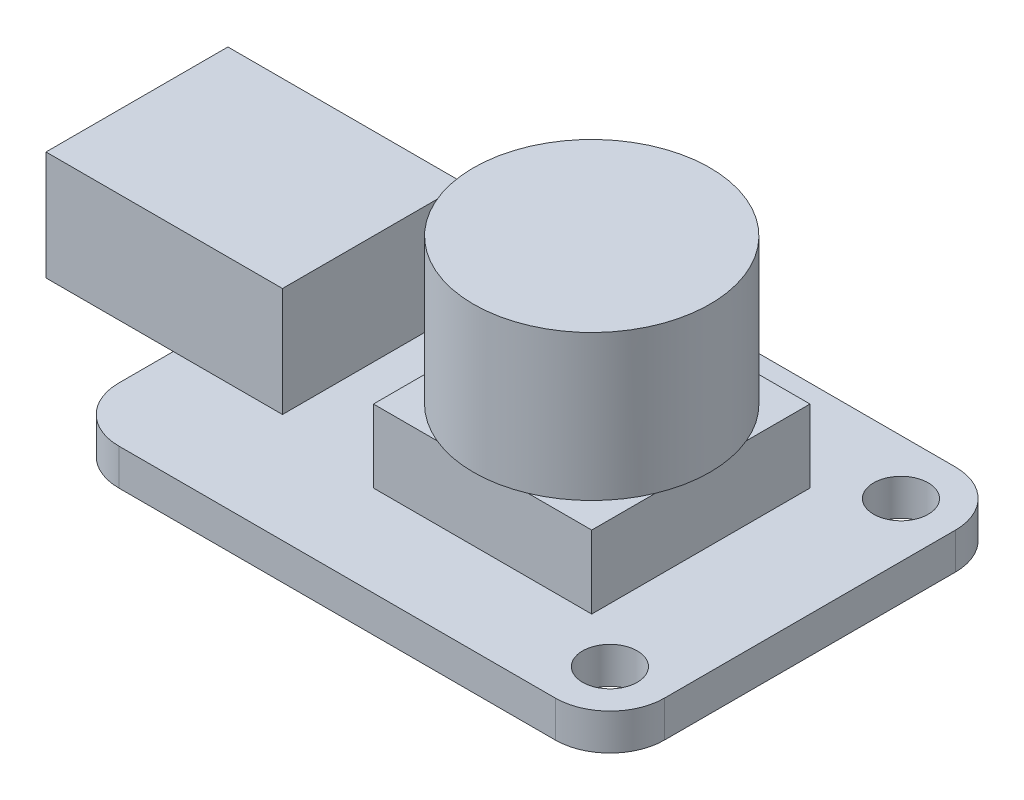
ISO-10303-21;
HEADER;
FILE_DESCRIPTION(('STEP AP214'),'2;1');
FILE_NAME('part.step','',(''),(''),'','','');
FILE_SCHEMA(('AUTOMOTIVE_DESIGN { 1 0 10303 214 1 1 1 1 }'));
ENDSEC;
DATA;
#1=APPLICATION_CONTEXT('core data for automotive mechanical design processes');
#2=APPLICATION_PROTOCOL_DEFINITION('international standard','automotive_design',2000,#1);
#3=PRODUCT_CONTEXT('',#1,'mechanical');
#4=PRODUCT('Part','Part','',(#3));
#5=PRODUCT_RELATED_PRODUCT_CATEGORY('part','',(#4));
#6=PRODUCT_DEFINITION_FORMATION('','',#4);
#7=PRODUCT_DEFINITION_CONTEXT('part definition',#1,'design');
#8=PRODUCT_DEFINITION('design','',#6,#7);
#9=PRODUCT_DEFINITION_SHAPE('','',#8);
#10=(LENGTH_UNIT() NAMED_UNIT(*) SI_UNIT(.MILLI.,.METRE.));
#11=(NAMED_UNIT(*) PLANE_ANGLE_UNIT() SI_UNIT($,.RADIAN.));
#12=(NAMED_UNIT(*) SI_UNIT($,.STERADIAN.) SOLID_ANGLE_UNIT());
#13=UNCERTAINTY_MEASURE_WITH_UNIT(LENGTH_MEASURE(1.E-05),#10,'distance_accuracy_value','');
#14=(GEOMETRIC_REPRESENTATION_CONTEXT(3) GLOBAL_UNCERTAINTY_ASSIGNED_CONTEXT((#13)) GLOBAL_UNIT_ASSIGNED_CONTEXT((#10,
#11,#12)) REPRESENTATION_CONTEXT('',''));
#15=CARTESIAN_POINT('',(0.,0.,0.));
#16=DIRECTION('',(0.,0.,1.));
#17=DIRECTION('',(1.,0.,0.));
#18=AXIS2_PLACEMENT_3D('',#15,#16,#17);
#19=CARTESIAN_POINT('',(0.,6.,0.));
#20=DIRECTION('',(0.,1.,0.));
#21=DIRECTION('',(0.,0.,1.));
#22=AXIS2_PLACEMENT_3D('',#19,#20,#21);
#23=PLANE('',#22);
#24=CARTESIAN_POINT('',(3.,6.,0.));
#25=DIRECTION('',(0.,1.,0.));
#26=DIRECTION('',(0.,0.,1.));
#27=AXIS2_PLACEMENT_3D('',#24,#25,#26);
#28=CIRCLE('',#27,6.5);
#29=CARTESIAN_POINT('',(5.5,6.,6.));
#30=VERTEX_POINT('',#29);
#31=CARTESIAN_POINT('',(9.,6.,2.5));
#32=VERTEX_POINT('',#31);
#33=EDGE_CURVE('E53',#30,#32,#28,.T.);
#34=ORIENTED_EDGE('',*,*,#33,.F.);
#35=DIRECTION('',(1.,0.,0.));
#36=VECTOR('',#35,1.);
#37=CARTESIAN_POINT('',(-3.,6.,6.));
#38=LINE('',#37,#36);
#39=CARTESIAN_POINT('',(9.,6.,6.));
#40=VERTEX_POINT('',#39);
#41=EDGE_CURVE('E189',#30,#40,#38,.T.);
#42=ORIENTED_EDGE('',*,*,#41,.T.);
#43=DIRECTION('',(0.,0.,-1.));
#44=VECTOR('',#43,1.);
#45=CARTESIAN_POINT('',(9.,6.,-6.));
#46=LINE('',#45,#44);
#47=EDGE_CURVE('E229',#40,#32,#46,.T.);
#48=ORIENTED_EDGE('',*,*,#47,.T.);
#49=EDGE_LOOP('',(#34,#42,#48));
#50=FACE_BOUND('',#49,.T.);
#51=ADVANCED_FACE('F35',(#50),#23,.T.);
#52=CARTESIAN_POINT('',(9.,6.,-2.5));
#53=VERTEX_POINT('',#52);
#54=CARTESIAN_POINT('',(5.5,6.,-6.));
#55=VERTEX_POINT('',#54);
#56=EDGE_CURVE('E11',#53,#55,#28,.T.);
#57=ORIENTED_EDGE('',*,*,#56,.F.);
#58=CARTESIAN_POINT('',(9.,6.,-6.));
#59=VERTEX_POINT('',#58);
#60=EDGE_CURVE('E244',#53,#59,#46,.T.);
#61=ORIENTED_EDGE('',*,*,#60,.T.);
#62=DIRECTION('',(-1.,0.,0.));
#63=VECTOR('',#62,1.);
#64=CARTESIAN_POINT('',(-3.,6.,-6.));
#65=LINE('',#64,#63);
#66=EDGE_CURVE('E226',#59,#55,#65,.T.);
#67=ORIENTED_EDGE('',*,*,#66,.T.);
#68=EDGE_LOOP('',(#57,#61,#67));
#69=FACE_BOUND('',#68,.T.);
#70=ADVANCED_FACE('F434',(#69),#23,.T.);
#71=CARTESIAN_POINT('',(0.499999999999997,6.,-6.));
#72=VERTEX_POINT('',#71);
#73=CARTESIAN_POINT('',(-3.,6.,-2.5));
#74=VERTEX_POINT('',#73);
#75=EDGE_CURVE('E44',#72,#74,#28,.T.);
#76=ORIENTED_EDGE('',*,*,#75,.F.);
#77=CARTESIAN_POINT('',(-3.,6.,-6.));
#78=VERTEX_POINT('',#77);
#79=EDGE_CURVE('E227',#72,#78,#65,.T.);
#80=ORIENTED_EDGE('',*,*,#79,.T.);
#81=DIRECTION('',(0.,0.,1.));
#82=VECTOR('',#81,1.);
#83=CARTESIAN_POINT('',(-3.,6.,-6.));
#84=LINE('',#83,#82);
#85=EDGE_CURVE('E231',#78,#74,#84,.T.);
#86=ORIENTED_EDGE('',*,*,#85,.T.);
#87=EDGE_LOOP('',(#76,#80,#86));
#88=FACE_BOUND('',#87,.T.);
#89=ADVANCED_FACE('F439',(#88),#23,.T.);
#90=CARTESIAN_POINT('',(12.,2.,-8.));
#91=DIRECTION('',(0.,1.,0.));
#92=DIRECTION('',(0.,0.,1.));
#93=AXIS2_PLACEMENT_3D('',#90,#91,#92);
#94=PLANE('',#93);
#95=DIRECTION('',(1.,0.,0.));
#96=VECTOR('',#95,1.);
#97=CARTESIAN_POINT('',(-22.,2.,5.));
#98=LINE('',#97,#96);
#99=CARTESIAN_POINT('',(-15.,2.,5.));
#100=VERTEX_POINT('',#99);
#101=CARTESIAN_POINT('',(-9.00000000000001,2.,5.));
#102=VERTEX_POINT('',#101);
#103=EDGE_CURVE('E204',#100,#102,#98,.T.);
#104=ORIENTED_EDGE('',*,*,#103,.F.);
#105=DIRECTION('',(0.,0.,1.));
#106=VECTOR('',#105,1.);
#107=CARTESIAN_POINT('',(-15.,2.,-7.99999999999998));
#108=LINE('',#107,#106);
#109=CARTESIAN_POINT('',(-15.,2.,7.99999999999998));
#110=VERTEX_POINT('',#109);
#111=EDGE_CURVE('E306',#100,#110,#108,.T.);
#112=ORIENTED_EDGE('',*,*,#111,.T.);
#113=CARTESIAN_POINT('',(-12.,2.,8.));
#114=DIRECTION('',(0.,1.,0.));
#115=DIRECTION('',(0.,0.,1.));
#116=AXIS2_PLACEMENT_3D('',#113,#114,#115);
#117=CIRCLE('',#116,3.);
#118=CARTESIAN_POINT('',(-12.,2.,11.));
#119=VERTEX_POINT('',#118);
#120=EDGE_CURVE('E309',#110,#119,#117,.T.);
#121=ORIENTED_EDGE('',*,*,#120,.T.);
#122=DIRECTION('',(1.,0.,0.));
#123=VECTOR('',#122,1.);
#124=CARTESIAN_POINT('',(-12.,2.,11.));
#125=LINE('',#124,#123);
#126=CARTESIAN_POINT('',(12.,2.,11.));
#127=VERTEX_POINT('',#126);
#128=EDGE_CURVE('E312',#119,#127,#125,.T.);
#129=ORIENTED_EDGE('',*,*,#128,.T.);
#130=CARTESIAN_POINT('',(12.,2.,8.));
#131=DIRECTION('',(0.,1.,0.));
#132=DIRECTION('',(0.,0.,-1.));
#133=AXIS2_PLACEMENT_3D('',#130,#131,#132);
#134=CIRCLE('',#133,3.);
#135=CARTESIAN_POINT('',(15.,2.,7.99999999999998));
#136=VERTEX_POINT('',#135);
#137=EDGE_CURVE('E314',#127,#136,#134,.T.);
#138=ORIENTED_EDGE('',*,*,#137,.T.);
#139=DIRECTION('',(0.,0.,-1.));
#140=VECTOR('',#139,1.);
#141=CARTESIAN_POINT('',(15.,2.,-7.99999999999998));
#142=LINE('',#141,#140);
#143=CARTESIAN_POINT('',(15.,2.,-7.99999999999998));
#144=VERTEX_POINT('',#143);
#145=EDGE_CURVE('E316',#136,#144,#142,.T.);
#146=ORIENTED_EDGE('',*,*,#145,.T.);
#147=CARTESIAN_POINT('',(12.,2.,-8.));
#148=DIRECTION('',(0.,1.,0.));
#149=DIRECTION('',(0.,0.,1.));
#150=AXIS2_PLACEMENT_3D('',#147,#148,#149);
#151=CIRCLE('',#150,3.);
#152=CARTESIAN_POINT('',(12.,2.,-11.));
#153=VERTEX_POINT('',#152);
#154=EDGE_CURVE('E298',#144,#153,#151,.T.);
#155=ORIENTED_EDGE('',*,*,#154,.T.);
#156=DIRECTION('',(-1.,0.,0.));
#157=VECTOR('',#156,1.);
#158=CARTESIAN_POINT('',(-12.,2.,-11.));
#159=LINE('',#158,#157);
#160=CARTESIAN_POINT('',(-12.,2.,-11.));
#161=VERTEX_POINT('',#160);
#162=EDGE_CURVE('E301',#153,#161,#159,.T.);
#163=ORIENTED_EDGE('',*,*,#162,.T.);
#164=CARTESIAN_POINT('',(-12.,2.,-8.));
#165=DIRECTION('',(0.,1.,0.));
#166=DIRECTION('',(0.,0.,-1.));
#167=AXIS2_PLACEMENT_3D('',#164,#165,#166);
#168=CIRCLE('',#167,3.);
#169=CARTESIAN_POINT('',(-15.,2.,-7.99999999999998));
#170=VERTEX_POINT('',#169);
#171=EDGE_CURVE('E304',#161,#170,#168,.T.);
#172=ORIENTED_EDGE('',*,*,#171,.T.);
#173=CARTESIAN_POINT('',(-15.,2.,-5.));
#174=VERTEX_POINT('',#173);
#175=EDGE_CURVE('E307',#170,#174,#108,.T.);
#176=ORIENTED_EDGE('',*,*,#175,.T.);
#177=DIRECTION('',(-1.,0.,0.));
#178=VECTOR('',#177,1.);
#179=CARTESIAN_POINT('',(-22.,2.,-5.));
#180=LINE('',#179,#178);
#181=CARTESIAN_POINT('',(-9.00000000000001,2.,-5.));
#182=VERTEX_POINT('',#181);
#183=EDGE_CURVE('E268',#182,#174,#180,.T.);
#184=ORIENTED_EDGE('',*,*,#183,.F.);
#185=DIRECTION('',(0.,0.,-1.));
#186=VECTOR('',#185,1.);
#187=CARTESIAN_POINT('',(-9.00000000000001,2.,-5.));
#188=LINE('',#187,#186);
#189=EDGE_CURVE('E254',#102,#182,#188,.T.);
#190=ORIENTED_EDGE('',*,*,#189,.F.);
#191=EDGE_LOOP('',(#104,#112,#121,#129,#138,#146,#155,#163,#172,#176,#184,#190));
#192=FACE_BOUND('',#191,.T.);
#193=CARTESIAN_POINT('',(12.,2.,-8.));
#194=DIRECTION('',(0.,1.,0.));
#195=DIRECTION('',(0.,0.,1.));
#196=AXIS2_PLACEMENT_3D('',#193,#194,#195);
#197=CIRCLE('',#196,1.5);
#198=CARTESIAN_POINT('',(12.,2.,-6.5));
#199=VERTEX_POINT('',#198);
#200=EDGE_CURVE('E292',#199,#199,#197,.T.);
#201=ORIENTED_EDGE('',*,*,#200,.F.);
#202=EDGE_LOOP('',(#201));
#203=FACE_BOUND('',#202,.T.);
#204=CARTESIAN_POINT('',(12.,2.,8.));
#205=DIRECTION('',(0.,1.,0.));
#206=DIRECTION('',(0.,0.,1.));
#207=AXIS2_PLACEMENT_3D('',#204,#205,#206);
#208=CIRCLE('',#207,1.5);
#209=CARTESIAN_POINT('',(12.,2.,9.5));
#210=VERTEX_POINT('',#209);
#211=EDGE_CURVE('E286',#210,#210,#208,.T.);
#212=ORIENTED_EDGE('',*,*,#211,.F.);
#213=EDGE_LOOP('',(#212));
#214=FACE_BOUND('',#213,.T.);
#215=DIRECTION('',(-1.,0.,0.));
#216=VECTOR('',#215,1.);
#217=CARTESIAN_POINT('',(-3.,2.,-6.));
#218=LINE('',#217,#216);
#219=CARTESIAN_POINT('',(9.,2.,-6.));
#220=VERTEX_POINT('',#219);
#221=CARTESIAN_POINT('',(-3.,2.,-6.));
#222=VERTEX_POINT('',#221);
#223=EDGE_CURVE('E237',#220,#222,#218,.T.);
#224=ORIENTED_EDGE('',*,*,#223,.F.);
#225=DIRECTION('',(0.,0.,-1.));
#226=VECTOR('',#225,1.);
#227=CARTESIAN_POINT('',(9.,2.,-6.));
#228=LINE('',#227,#226);
#229=CARTESIAN_POINT('',(9.,2.,6.));
#230=VERTEX_POINT('',#229);
#231=EDGE_CURVE('E213',#230,#220,#228,.T.);
#232=ORIENTED_EDGE('',*,*,#231,.F.);
#233=DIRECTION('',(1.,0.,0.));
#234=VECTOR('',#233,1.);
#235=CARTESIAN_POINT('',(-3.,2.,6.));
#236=LINE('',#235,#234);
#237=CARTESIAN_POINT('',(-3.,2.,6.));
#238=VERTEX_POINT('',#237);
#239=EDGE_CURVE('E242',#238,#230,#236,.T.);
#240=ORIENTED_EDGE('',*,*,#239,.F.);
#241=DIRECTION('',(0.,0.,1.));
#242=VECTOR('',#241,1.);
#243=CARTESIAN_POINT('',(-3.,2.,-6.));
#244=LINE('',#243,#242);
#245=EDGE_CURVE('E239',#222,#238,#244,.T.);
#246=ORIENTED_EDGE('',*,*,#245,.F.);
#247=EDGE_LOOP('',(#224,#232,#240,#246));
#248=FACE_BOUND('',#247,.T.);
#249=ADVANCED_FACE('F382',(#192,#203,#214,#248),#94,.T.);
#250=CARTESIAN_POINT('',(12.,0.,-8.));
#251=DIRECTION('',(0.,1.,0.));
#252=DIRECTION('',(0.,0.,1.));
#253=AXIS2_PLACEMENT_3D('',#250,#251,#252);
#254=PLANE('',#253);
#255=CARTESIAN_POINT('',(12.,0.,-8.));
#256=DIRECTION('',(0.,1.,0.));
#257=DIRECTION('',(0.,0.,1.));
#258=AXIS2_PLACEMENT_3D('',#255,#256,#257);
#259=CIRCLE('',#258,3.);
#260=CARTESIAN_POINT('',(15.,0.,-7.99999999999998));
#261=VERTEX_POINT('',#260);
#262=CARTESIAN_POINT('',(12.,0.,-11.));
#263=VERTEX_POINT('',#262);
#264=EDGE_CURVE('E295',#261,#263,#259,.T.);
#265=ORIENTED_EDGE('',*,*,#264,.F.);
#266=DIRECTION('',(0.,0.,-1.));
#267=VECTOR('',#266,1.);
#268=CARTESIAN_POINT('',(15.,0.,-7.99999999999998));
#269=LINE('',#268,#267);
#270=CARTESIAN_POINT('',(15.,0.,7.99999999999998));
#271=VERTEX_POINT('',#270);
#272=EDGE_CURVE('E302',#271,#261,#269,.T.);
#273=ORIENTED_EDGE('',*,*,#272,.F.);
#274=CARTESIAN_POINT('',(12.,0.,8.));
#275=DIRECTION('',(0.,1.,0.));
#276=DIRECTION('',(0.,0.,-1.));
#277=AXIS2_PLACEMENT_3D('',#274,#275,#276);
#278=CIRCLE('',#277,3.);
#279=CARTESIAN_POINT('',(12.,0.,11.));
#280=VERTEX_POINT('',#279);
#281=EDGE_CURVE('E331',#280,#271,#278,.T.);
#282=ORIENTED_EDGE('',*,*,#281,.F.);
#283=DIRECTION('',(1.,0.,0.));
#284=VECTOR('',#283,1.);
#285=CARTESIAN_POINT('',(-12.,0.,11.));
#286=LINE('',#285,#284);
#287=CARTESIAN_POINT('',(-12.,0.,11.));
#288=VERTEX_POINT('',#287);
#289=EDGE_CURVE('E329',#288,#280,#286,.T.);
#290=ORIENTED_EDGE('',*,*,#289,.F.);
#291=CARTESIAN_POINT('',(-12.,0.,8.));
#292=DIRECTION('',(0.,1.,0.));
#293=DIRECTION('',(0.,0.,1.));
#294=AXIS2_PLACEMENT_3D('',#291,#292,#293);
#295=CIRCLE('',#294,3.);
#296=CARTESIAN_POINT('',(-15.,0.,7.99999999999998));
#297=VERTEX_POINT('',#296);
#298=EDGE_CURVE('E327',#297,#288,#295,.T.);
#299=ORIENTED_EDGE('',*,*,#298,.F.);
#300=DIRECTION('',(0.,0.,1.));
#301=VECTOR('',#300,1.);
#302=CARTESIAN_POINT('',(-15.,0.,-7.99999999999998));
#303=LINE('',#302,#301);
#304=CARTESIAN_POINT('',(-15.,0.,-7.99999999999998));
#305=VERTEX_POINT('',#304);
#306=EDGE_CURVE('E325',#305,#297,#303,.T.);
#307=ORIENTED_EDGE('',*,*,#306,.F.);
#308=CARTESIAN_POINT('',(-12.,0.,-8.));
#309=DIRECTION('',(0.,1.,0.));
#310=DIRECTION('',(0.,0.,-1.));
#311=AXIS2_PLACEMENT_3D('',#308,#309,#310);
#312=CIRCLE('',#311,3.);
#313=CARTESIAN_POINT('',(-12.,0.,-11.));
#314=VERTEX_POINT('',#313);
#315=EDGE_CURVE('E323',#314,#305,#312,.T.);
#316=ORIENTED_EDGE('',*,*,#315,.F.);
#317=DIRECTION('',(-1.,0.,0.));
#318=VECTOR('',#317,1.);
#319=CARTESIAN_POINT('',(-12.,0.,-11.));
#320=LINE('',#319,#318);
#321=EDGE_CURVE('E321',#263,#314,#320,.T.);
#322=ORIENTED_EDGE('',*,*,#321,.F.);
#323=EDGE_LOOP('',(#265,#273,#282,#290,#299,#307,#316,#322));
#324=FACE_BOUND('',#323,.T.);
#325=CARTESIAN_POINT('',(12.,0.,-8.));
#326=DIRECTION('',(0.,1.,0.));
#327=DIRECTION('',(0.,0.,1.));
#328=AXIS2_PLACEMENT_3D('',#325,#326,#327);
#329=CIRCLE('',#328,1.5);
#330=CARTESIAN_POINT('',(12.,0.,-6.5));
#331=VERTEX_POINT('',#330);
#332=EDGE_CURVE('E289',#331,#331,#329,.T.);
#333=ORIENTED_EDGE('',*,*,#332,.T.);
#334=EDGE_LOOP('',(#333));
#335=FACE_BOUND('',#334,.T.);
#336=CARTESIAN_POINT('',(12.,0.,8.));
#337=DIRECTION('',(0.,1.,0.));
#338=DIRECTION('',(0.,0.,1.));
#339=AXIS2_PLACEMENT_3D('',#336,#337,#338);
#340=CIRCLE('',#339,1.5);
#341=CARTESIAN_POINT('',(12.,0.,9.5));
#342=VERTEX_POINT('',#341);
#343=EDGE_CURVE('E285',#342,#342,#340,.T.);
#344=ORIENTED_EDGE('',*,*,#343,.T.);
#345=EDGE_LOOP('',(#344));
#346=FACE_BOUND('',#345,.T.);
#347=ADVANCED_FACE('F366',(#324,#335,#346),#254,.F.);
#348=CARTESIAN_POINT('',(12.,2.,-8.));
#349=DIRECTION('',(0.,-1.,0.));
#350=DIRECTION('',(0.,0.,-1.));
#351=AXIS2_PLACEMENT_3D('',#348,#349,#350);
#352=CYLINDRICAL_SURFACE('',#351,3.);
#353=ORIENTED_EDGE('',*,*,#264,.T.);
#354=DIRECTION('',(0.,-1.,0.));
#355=VECTOR('',#354,1.);
#356=CARTESIAN_POINT('',(12.,2.,-11.));
#357=LINE('',#356,#355);
#358=EDGE_CURVE('E39',#153,#263,#357,.T.);
#359=ORIENTED_EDGE('',*,*,#358,.F.);
#360=ORIENTED_EDGE('',*,*,#154,.F.);
#361=DIRECTION('',(0.,-1.,0.));
#362=VECTOR('',#361,1.);
#363=CARTESIAN_POINT('',(15.,2.,-7.99999999999998));
#364=LINE('',#363,#362);
#365=EDGE_CURVE('E318',#144,#261,#364,.T.);
#366=ORIENTED_EDGE('',*,*,#365,.T.);
#367=EDGE_LOOP('',(#353,#359,#360,#366));
#368=FACE_BOUND('',#367,.T.);
#369=ADVANCED_FACE('F37',(#368),#352,.T.);
#370=CARTESIAN_POINT('',(-12.,2.,-11.));
#371=DIRECTION('',(0.,0.,1.));
#372=DIRECTION('',(1.,0.,0.));
#373=AXIS2_PLACEMENT_3D('',#370,#371,#372);
#374=PLANE('',#373);
#375=ORIENTED_EDGE('',*,*,#321,.T.);
#376=DIRECTION('',(0.,-1.,0.));
#377=VECTOR('',#376,1.);
#378=CARTESIAN_POINT('',(-12.,2.,-11.));
#379=LINE('',#378,#377);
#380=EDGE_CURVE('E350',#161,#314,#379,.T.);
#381=ORIENTED_EDGE('',*,*,#380,.F.);
#382=ORIENTED_EDGE('',*,*,#162,.F.);
#383=ORIENTED_EDGE('',*,*,#358,.T.);
#384=EDGE_LOOP('',(#375,#381,#382,#383));
#385=FACE_BOUND('',#384,.T.);
#386=ADVANCED_FACE('F359',(#385),#374,.F.);
#387=CARTESIAN_POINT('',(-12.,2.,-8.));
#388=DIRECTION('',(0.,-1.,0.));
#389=DIRECTION('',(0.,0.,-1.));
#390=AXIS2_PLACEMENT_3D('',#387,#388,#389);
#391=CYLINDRICAL_SURFACE('',#390,3.);
#392=ORIENTED_EDGE('',*,*,#315,.T.);
#393=DIRECTION('',(0.,-1.,0.));
#394=VECTOR('',#393,1.);
#395=CARTESIAN_POINT('',(-15.,2.,-7.99999999999998));
#396=LINE('',#395,#394);
#397=EDGE_CURVE('E348',#170,#305,#396,.T.);
#398=ORIENTED_EDGE('',*,*,#397,.F.);
#399=ORIENTED_EDGE('',*,*,#171,.F.);
#400=ORIENTED_EDGE('',*,*,#380,.T.);
#401=EDGE_LOOP('',(#392,#398,#399,#400));
#402=FACE_BOUND('',#401,.T.);
#403=ADVANCED_FACE('F372',(#402),#391,.T.);
#404=CARTESIAN_POINT('',(-15.,2.,-7.99999999999998));
#405=DIRECTION('',(1.,0.,0.));
#406=DIRECTION('',(0.,0.,-1.));
#407=AXIS2_PLACEMENT_3D('',#404,#405,#406);
#408=PLANE('',#407);
#409=ORIENTED_EDGE('',*,*,#306,.T.);
#410=DIRECTION('',(0.,-1.,0.));
#411=VECTOR('',#410,1.);
#412=CARTESIAN_POINT('',(-15.,2.,7.99999999999998));
#413=LINE('',#412,#411);
#414=EDGE_CURVE('E345',#110,#297,#413,.T.);
#415=ORIENTED_EDGE('',*,*,#414,.F.);
#416=ORIENTED_EDGE('',*,*,#111,.F.);
#417=EDGE_CURVE('E310',#174,#100,#108,.T.);
#418=ORIENTED_EDGE('',*,*,#417,.F.);
#419=ORIENTED_EDGE('',*,*,#175,.F.);
#420=ORIENTED_EDGE('',*,*,#397,.T.);
#421=EDGE_LOOP('',(#409,#415,#416,#418,#419,#420));
#422=FACE_BOUND('',#421,.T.);
#423=ADVANCED_FACE('F375',(#422),#408,.F.);
#424=CARTESIAN_POINT('',(-12.,2.,8.));
#425=DIRECTION('',(0.,-1.,0.));
#426=DIRECTION('',(0.,0.,-1.));
#427=AXIS2_PLACEMENT_3D('',#424,#425,#426);
#428=CYLINDRICAL_SURFACE('',#427,3.);
#429=ORIENTED_EDGE('',*,*,#298,.T.);
#430=DIRECTION('',(0.,-1.,0.));
#431=VECTOR('',#430,1.);
#432=CARTESIAN_POINT('',(-12.,2.,11.));
#433=LINE('',#432,#431);
#434=EDGE_CURVE('E342',#119,#288,#433,.T.);
#435=ORIENTED_EDGE('',*,*,#434,.F.);
#436=ORIENTED_EDGE('',*,*,#120,.F.);
#437=ORIENTED_EDGE('',*,*,#414,.T.);
#438=EDGE_LOOP('',(#429,#435,#436,#437));
#439=FACE_BOUND('',#438,.T.);
#440=ADVANCED_FACE('F399',(#439),#428,.T.);
#441=CARTESIAN_POINT('',(-12.,2.,11.));
#442=DIRECTION('',(0.,0.,-1.));
#443=DIRECTION('',(-1.,0.,0.));
#444=AXIS2_PLACEMENT_3D('',#441,#442,#443);
#445=PLANE('',#444);
#446=ORIENTED_EDGE('',*,*,#289,.T.);
#447=DIRECTION('',(0.,-1.,0.));
#448=VECTOR('',#447,1.);
#449=CARTESIAN_POINT('',(12.,2.,11.));
#450=LINE('',#449,#448);
#451=EDGE_CURVE('E339',#127,#280,#450,.T.);
#452=ORIENTED_EDGE('',*,*,#451,.F.);
#453=ORIENTED_EDGE('',*,*,#128,.F.);
#454=ORIENTED_EDGE('',*,*,#434,.T.);
#455=EDGE_LOOP('',(#446,#452,#453,#454));
#456=FACE_BOUND('',#455,.T.);
#457=ADVANCED_FACE('F394',(#456),#445,.F.);
#458=CARTESIAN_POINT('',(12.,2.,8.));
#459=DIRECTION('',(0.,-1.,0.));
#460=DIRECTION('',(0.,0.,-1.));
#461=AXIS2_PLACEMENT_3D('',#458,#459,#460);
#462=CYLINDRICAL_SURFACE('',#461,3.);
#463=ORIENTED_EDGE('',*,*,#281,.T.);
#464=DIRECTION('',(0.,-1.,0.));
#465=VECTOR('',#464,1.);
#466=CARTESIAN_POINT('',(15.,2.,7.99999999999998));
#467=LINE('',#466,#465);
#468=EDGE_CURVE('E336',#136,#271,#467,.T.);
#469=ORIENTED_EDGE('',*,*,#468,.F.);
#470=ORIENTED_EDGE('',*,*,#137,.F.);
#471=ORIENTED_EDGE('',*,*,#451,.T.);
#472=EDGE_LOOP('',(#463,#469,#470,#471));
#473=FACE_BOUND('',#472,.T.);
#474=ADVANCED_FACE('F390',(#473),#462,.T.);
#475=CARTESIAN_POINT('',(15.,2.,-7.99999999999998));
#476=DIRECTION('',(-1.,0.,0.));
#477=DIRECTION('',(0.,0.,1.));
#478=AXIS2_PLACEMENT_3D('',#475,#476,#477);
#479=PLANE('',#478);
#480=ORIENTED_EDGE('',*,*,#272,.T.);
#481=ORIENTED_EDGE('',*,*,#365,.F.);
#482=ORIENTED_EDGE('',*,*,#145,.F.);
#483=ORIENTED_EDGE('',*,*,#468,.T.);
#484=EDGE_LOOP('',(#480,#481,#482,#483));
#485=FACE_BOUND('',#484,.T.);
#486=ADVANCED_FACE('F388',(#485),#479,.F.);
#487=CARTESIAN_POINT('',(12.,2.,-8.));
#488=DIRECTION('',(0.,-1.,0.));
#489=DIRECTION('',(0.,0.,-1.));
#490=AXIS2_PLACEMENT_3D('',#487,#488,#489);
#491=CYLINDRICAL_SURFACE('',#490,1.5);
#492=ORIENTED_EDGE('',*,*,#200,.T.);
#493=EDGE_LOOP('',(#492));
#494=FACE_BOUND('',#493,.T.);
#495=ORIENTED_EDGE('',*,*,#332,.F.);
#496=EDGE_LOOP('',(#495));
#497=FACE_BOUND('',#496,.T.);
#498=ADVANCED_FACE('F624',(#494,#497),#491,.F.);
#499=CARTESIAN_POINT('',(12.,2.,8.));
#500=DIRECTION('',(0.,-1.,0.));
#501=DIRECTION('',(0.,0.,-1.));
#502=AXIS2_PLACEMENT_3D('',#499,#500,#501);
#503=CYLINDRICAL_SURFACE('',#502,1.5);
#504=ORIENTED_EDGE('',*,*,#211,.T.);
#505=EDGE_LOOP('',(#504));
#506=FACE_BOUND('',#505,.T.);
#507=ORIENTED_EDGE('',*,*,#343,.F.);
#508=EDGE_LOOP('',(#507));
#509=FACE_BOUND('',#508,.T.);
#510=ADVANCED_FACE('F604',(#506,#509),#503,.F.);
#511=CARTESIAN_POINT('',(0.,2.,0.));
#512=DIRECTION('',(0.,1.,0.));
#513=DIRECTION('',(0.,0.,1.));
#514=AXIS2_PLACEMENT_3D('',#511,#512,#513);
#515=PLANE('',#514);
#516=CARTESIAN_POINT('',(-22.,2.,-5.));
#517=VERTEX_POINT('',#516);
#518=EDGE_CURVE('E267',#174,#517,#180,.T.);
#519=ORIENTED_EDGE('',*,*,#518,.F.);
#520=ORIENTED_EDGE('',*,*,#417,.T.);
#521=CARTESIAN_POINT('',(-22.,2.,5.));
#522=VERTEX_POINT('',#521);
#523=EDGE_CURVE('E207',#522,#100,#98,.T.);
#524=ORIENTED_EDGE('',*,*,#523,.F.);
#525=DIRECTION('',(0.,0.,1.));
#526=VECTOR('',#525,1.);
#527=CARTESIAN_POINT('',(-22.,2.,-5.));
#528=LINE('',#527,#526);
#529=EDGE_CURVE('E271',#517,#522,#528,.T.);
#530=ORIENTED_EDGE('',*,*,#529,.F.);
#531=EDGE_LOOP('',(#519,#520,#524,#530));
#532=FACE_BOUND('',#531,.T.);
#533=ADVANCED_FACE('F402',(#532),#515,.F.);
#534=CARTESIAN_POINT('',(-9.00000000000001,8.,-5.));
#535=DIRECTION('',(-1.,0.,0.));
#536=DIRECTION('',(0.,0.,1.));
#537=AXIS2_PLACEMENT_3D('',#534,#535,#536);
#538=PLANE('',#537);
#539=ORIENTED_EDGE('',*,*,#189,.T.);
#540=DIRECTION('',(0.,-1.,0.));
#541=VECTOR('',#540,1.);
#542=CARTESIAN_POINT('',(-9.00000000000001,8.,-5.));
#543=LINE('',#542,#541);
#544=CARTESIAN_POINT('',(-9.00000000000001,8.,-5.));
#545=VERTEX_POINT('',#544);
#546=EDGE_CURVE('E282',#545,#182,#543,.T.);
#547=ORIENTED_EDGE('',*,*,#546,.F.);
#548=DIRECTION('',(0.,0.,-1.));
#549=VECTOR('',#548,1.);
#550=CARTESIAN_POINT('',(-9.00000000000001,8.,-5.));
#551=LINE('',#550,#549);
#552=CARTESIAN_POINT('',(-9.00000000000001,8.,5.));
#553=VERTEX_POINT('',#552);
#554=EDGE_CURVE('E255',#553,#545,#551,.T.);
#555=ORIENTED_EDGE('',*,*,#554,.F.);
#556=DIRECTION('',(0.,-1.,0.));
#557=VECTOR('',#556,1.);
#558=CARTESIAN_POINT('',(-9.00000000000001,8.,5.));
#559=LINE('',#558,#557);
#560=EDGE_CURVE('E264',#553,#102,#559,.T.);
#561=ORIENTED_EDGE('',*,*,#560,.T.);
#562=EDGE_LOOP('',(#539,#547,#555,#561));
#563=FACE_BOUND('',#562,.T.);
#564=ADVANCED_FACE('F418',(#563),#538,.F.);
#565=CARTESIAN_POINT('',(-22.,8.,-5.));
#566=DIRECTION('',(0.,0.,1.));
#567=DIRECTION('',(1.,0.,0.));
#568=AXIS2_PLACEMENT_3D('',#565,#566,#567);
#569=PLANE('',#568);
#570=ORIENTED_EDGE('',*,*,#183,.T.);
#571=ORIENTED_EDGE('',*,*,#518,.T.);
#572=DIRECTION('',(0.,-1.,0.));
#573=VECTOR('',#572,1.);
#574=CARTESIAN_POINT('',(-22.,8.,-5.));
#575=LINE('',#574,#573);
#576=CARTESIAN_POINT('',(-22.,8.,-5.));
#577=VERTEX_POINT('',#576);
#578=EDGE_CURVE('E279',#577,#517,#575,.T.);
#579=ORIENTED_EDGE('',*,*,#578,.F.);
#580=DIRECTION('',(-1.,0.,0.));
#581=VECTOR('',#580,1.);
#582=CARTESIAN_POINT('',(-22.,8.,-5.));
#583=LINE('',#582,#581);
#584=EDGE_CURVE('E258',#545,#577,#583,.T.);
#585=ORIENTED_EDGE('',*,*,#584,.F.);
#586=ORIENTED_EDGE('',*,*,#546,.T.);
#587=EDGE_LOOP('',(#570,#571,#579,#585,#586));
#588=FACE_BOUND('',#587,.T.);
#589=ADVANCED_FACE('F414',(#588),#569,.F.);
#590=CARTESIAN_POINT('',(-22.,8.,-5.));
#591=DIRECTION('',(1.,0.,0.));
#592=DIRECTION('',(0.,0.,-1.));
#593=AXIS2_PLACEMENT_3D('',#590,#591,#592);
#594=PLANE('',#593);
#595=ORIENTED_EDGE('',*,*,#529,.T.);
#596=DIRECTION('',(0.,-1.,0.));
#597=VECTOR('',#596,1.);
#598=CARTESIAN_POINT('',(-22.,8.,5.));
#599=LINE('',#598,#597);
#600=CARTESIAN_POINT('',(-22.,8.,5.));
#601=VERTEX_POINT('',#600);
#602=EDGE_CURVE('E276',#601,#522,#599,.T.);
#603=ORIENTED_EDGE('',*,*,#602,.F.);
#604=DIRECTION('',(0.,0.,1.));
#605=VECTOR('',#604,1.);
#606=CARTESIAN_POINT('',(-22.,8.,-5.));
#607=LINE('',#606,#605);
#608=EDGE_CURVE('E260',#577,#601,#607,.T.);
#609=ORIENTED_EDGE('',*,*,#608,.F.);
#610=ORIENTED_EDGE('',*,*,#578,.T.);
#611=EDGE_LOOP('',(#595,#603,#609,#610));
#612=FACE_BOUND('',#611,.T.);
#613=ADVANCED_FACE('F411',(#612),#594,.F.);
#614=CARTESIAN_POINT('',(-22.,8.,5.));
#615=DIRECTION('',(0.,0.,-1.));
#616=DIRECTION('',(-1.,0.,0.));
#617=AXIS2_PLACEMENT_3D('',#614,#615,#616);
#618=PLANE('',#617);
#619=ORIENTED_EDGE('',*,*,#523,.T.);
#620=ORIENTED_EDGE('',*,*,#103,.T.);
#621=ORIENTED_EDGE('',*,*,#560,.F.);
#622=DIRECTION('',(1.,0.,0.));
#623=VECTOR('',#622,1.);
#624=CARTESIAN_POINT('',(-22.,8.,5.));
#625=LINE('',#624,#623);
#626=EDGE_CURVE('E262',#601,#553,#625,.T.);
#627=ORIENTED_EDGE('',*,*,#626,.F.);
#628=ORIENTED_EDGE('',*,*,#602,.T.);
#629=EDGE_LOOP('',(#619,#620,#621,#627,#628));
#630=FACE_BOUND('',#629,.T.);
#631=ADVANCED_FACE('F405',(#630),#618,.F.);
#632=CARTESIAN_POINT('',(0.,8.,0.));
#633=DIRECTION('',(0.,1.,0.));
#634=DIRECTION('',(0.,0.,1.));
#635=AXIS2_PLACEMENT_3D('',#632,#633,#634);
#636=PLANE('',#635);
#637=ORIENTED_EDGE('',*,*,#554,.T.);
#638=ORIENTED_EDGE('',*,*,#584,.T.);
#639=ORIENTED_EDGE('',*,*,#608,.T.);
#640=ORIENTED_EDGE('',*,*,#626,.T.);
#641=EDGE_LOOP('',(#637,#638,#639,#640));
#642=FACE_BOUND('',#641,.T.);
#643=ADVANCED_FACE('F420',(#642),#636,.T.);
#644=CARTESIAN_POINT('',(9.,6.,-6.));
#645=DIRECTION('',(-1.,0.,0.));
#646=DIRECTION('',(0.,0.,1.));
#647=AXIS2_PLACEMENT_3D('',#644,#645,#646);
#648=PLANE('',#647);
#649=ORIENTED_EDGE('',*,*,#231,.T.);
#650=DIRECTION('',(0.,-1.,0.));
#651=VECTOR('',#650,1.);
#652=CARTESIAN_POINT('',(9.,6.,-6.));
#653=LINE('',#652,#651);
#654=EDGE_CURVE('E252',#59,#220,#653,.T.);
#655=ORIENTED_EDGE('',*,*,#654,.F.);
#656=ORIENTED_EDGE('',*,*,#60,.F.);
#657=EDGE_CURVE('E710',#32,#53,#46,.T.);
#658=ORIENTED_EDGE('',*,*,#657,.F.);
#659=ORIENTED_EDGE('',*,*,#47,.F.);
#660=DIRECTION('',(0.,-1.,0.));
#661=VECTOR('',#660,1.);
#662=CARTESIAN_POINT('',(9.,6.,6.));
#663=LINE('',#662,#661);
#664=EDGE_CURVE('E186',#40,#230,#663,.T.);
#665=ORIENTED_EDGE('',*,*,#664,.T.);
#666=EDGE_LOOP('',(#649,#655,#656,#658,#659,#665));
#667=FACE_BOUND('',#666,.T.);
#668=ADVANCED_FACE('F422',(#667),#648,.F.);
#669=CARTESIAN_POINT('',(-3.,6.,-6.));
#670=DIRECTION('',(0.,0.,1.));
#671=DIRECTION('',(1.,0.,0.));
#672=AXIS2_PLACEMENT_3D('',#669,#670,#671);
#673=PLANE('',#672);
#674=ORIENTED_EDGE('',*,*,#223,.T.);
#675=DIRECTION('',(0.,-1.,0.));
#676=VECTOR('',#675,1.);
#677=CARTESIAN_POINT('',(-3.,6.,-6.));
#678=LINE('',#677,#676);
#679=EDGE_CURVE('E249',#78,#222,#678,.T.);
#680=ORIENTED_EDGE('',*,*,#679,.F.);
#681=ORIENTED_EDGE('',*,*,#79,.F.);
#682=EDGE_CURVE('E221',#55,#72,#65,.T.);
#683=ORIENTED_EDGE('',*,*,#682,.F.);
#684=ORIENTED_EDGE('',*,*,#66,.F.);
#685=ORIENTED_EDGE('',*,*,#654,.T.);
#686=EDGE_LOOP('',(#674,#680,#681,#683,#684,#685));
#687=FACE_BOUND('',#686,.T.);
#688=ADVANCED_FACE('F428',(#687),#673,.F.);
#689=CARTESIAN_POINT('',(-3.,6.,-6.));
#690=DIRECTION('',(1.,0.,0.));
#691=DIRECTION('',(0.,0.,-1.));
#692=AXIS2_PLACEMENT_3D('',#689,#690,#691);
#693=PLANE('',#692);
#694=ORIENTED_EDGE('',*,*,#245,.T.);
#695=DIRECTION('',(0.,-1.,0.));
#696=VECTOR('',#695,1.);
#697=CARTESIAN_POINT('',(-3.,6.,6.));
#698=LINE('',#697,#696);
#699=CARTESIAN_POINT('',(-3.,6.,6.));
#700=VERTEX_POINT('',#699);
#701=EDGE_CURVE('E247',#700,#238,#698,.T.);
#702=ORIENTED_EDGE('',*,*,#701,.F.);
#703=CARTESIAN_POINT('',(-3.,6.,2.5));
#704=VERTEX_POINT('',#703);
#705=EDGE_CURVE('E183',#704,#700,#84,.T.);
#706=ORIENTED_EDGE('',*,*,#705,.F.);
#707=EDGE_CURVE('E233',#74,#704,#84,.T.);
#708=ORIENTED_EDGE('',*,*,#707,.F.);
#709=ORIENTED_EDGE('',*,*,#85,.F.);
#710=ORIENTED_EDGE('',*,*,#679,.T.);
#711=EDGE_LOOP('',(#694,#702,#706,#708,#709,#710));
#712=FACE_BOUND('',#711,.T.);
#713=ADVANCED_FACE('F451',(#712),#693,.F.);
#714=CARTESIAN_POINT('',(-3.,6.,6.));
#715=DIRECTION('',(0.,0.,-1.));
#716=DIRECTION('',(-1.,0.,0.));
#717=AXIS2_PLACEMENT_3D('',#714,#715,#716);
#718=PLANE('',#717);
#719=ORIENTED_EDGE('',*,*,#239,.T.);
#720=ORIENTED_EDGE('',*,*,#664,.F.);
#721=ORIENTED_EDGE('',*,*,#41,.F.);
#722=CARTESIAN_POINT('',(0.499999999999997,6.,6.));
#723=VERTEX_POINT('',#722);
#724=EDGE_CURVE('E187',#723,#30,#38,.T.);
#725=ORIENTED_EDGE('',*,*,#724,.F.);
#726=EDGE_CURVE('E180',#700,#723,#38,.T.);
#727=ORIENTED_EDGE('',*,*,#726,.F.);
#728=ORIENTED_EDGE('',*,*,#701,.T.);
#729=EDGE_LOOP('',(#719,#720,#721,#725,#727,#728));
#730=FACE_BOUND('',#729,.T.);
#731=ADVANCED_FACE('F192',(#730),#718,.F.);
#732=EDGE_CURVE('E61',#704,#723,#28,.T.);
#733=ORIENTED_EDGE('',*,*,#732,.F.);
#734=ORIENTED_EDGE('',*,*,#705,.T.);
#735=ORIENTED_EDGE('',*,*,#726,.T.);
#736=EDGE_LOOP('',(#733,#734,#735));
#737=FACE_BOUND('',#736,.T.);
#738=ADVANCED_FACE('F182',(#737),#23,.T.);
#739=CARTESIAN_POINT('',(3.,6.,0.));
#740=DIRECTION('',(0.,1.,0.));
#741=DIRECTION('',(0.,0.,1.));
#742=AXIS2_PLACEMENT_3D('',#739,#740,#741);
#743=PLANE('',#742);
#744=EDGE_CURVE('E46',#32,#53,#28,.T.);
#745=ORIENTED_EDGE('',*,*,#744,.F.);
#746=ORIENTED_EDGE('',*,*,#657,.T.);
#747=EDGE_LOOP('',(#745,#746));
#748=FACE_BOUND('',#747,.T.);
#749=ADVANCED_FACE('F444',(#748),#743,.F.);
#750=EDGE_CURVE('E214',#55,#72,#28,.T.);
#751=ORIENTED_EDGE('',*,*,#750,.F.);
#752=ORIENTED_EDGE('',*,*,#682,.T.);
#753=EDGE_LOOP('',(#751,#752));
#754=FACE_BOUND('',#753,.T.);
#755=ADVANCED_FACE('F220',(#754),#743,.F.);
#756=EDGE_CURVE('E199',#74,#704,#28,.T.);
#757=ORIENTED_EDGE('',*,*,#756,.F.);
#758=ORIENTED_EDGE('',*,*,#707,.T.);
#759=EDGE_LOOP('',(#757,#758));
#760=FACE_BOUND('',#759,.T.);
#761=ADVANCED_FACE('F465',(#760),#743,.F.);
#762=EDGE_CURVE('E196',#723,#30,#28,.T.);
#763=ORIENTED_EDGE('',*,*,#762,.F.);
#764=ORIENTED_EDGE('',*,*,#724,.T.);
#765=EDGE_LOOP('',(#763,#764));
#766=FACE_BOUND('',#765,.T.);
#767=ADVANCED_FACE('F197',(#766),#743,.F.);
#768=CARTESIAN_POINT('',(3.,14.,0.));
#769=DIRECTION('',(0.,-1.,0.));
#770=DIRECTION('',(0.,0.,-1.));
#771=AXIS2_PLACEMENT_3D('',#768,#769,#770);
#772=CYLINDRICAL_SURFACE('',#771,6.5);
#773=CARTESIAN_POINT('',(3.,14.,0.));
#774=DIRECTION('',(0.,1.,0.));
#775=DIRECTION('',(0.,0.,1.));
#776=AXIS2_PLACEMENT_3D('',#773,#774,#775);
#777=CIRCLE('',#776,6.5);
#778=CARTESIAN_POINT('',(3.,14.,6.5));
#779=VERTEX_POINT('',#778);
#780=EDGE_CURVE('E210',#779,#779,#777,.T.);
#781=ORIENTED_EDGE('',*,*,#780,.F.);
#782=EDGE_LOOP('',(#781));
#783=FACE_BOUND('',#782,.T.);
#784=ORIENTED_EDGE('',*,*,#33,.T.);
#785=ORIENTED_EDGE('',*,*,#744,.T.);
#786=ORIENTED_EDGE('',*,*,#56,.T.);
#787=ORIENTED_EDGE('',*,*,#750,.T.);
#788=ORIENTED_EDGE('',*,*,#75,.T.);
#789=ORIENTED_EDGE('',*,*,#756,.T.);
#790=ORIENTED_EDGE('',*,*,#732,.T.);
#791=ORIENTED_EDGE('',*,*,#762,.T.);
#792=EDGE_LOOP('',(#784,#785,#786,#787,#788,#789,#790,#791));
#793=FACE_BOUND('',#792,.T.);
#794=ADVANCED_FACE('F201',(#783,#793),#772,.T.);
#795=CARTESIAN_POINT('',(3.,14.,0.));
#796=DIRECTION('',(0.,1.,0.));
#797=DIRECTION('',(0.,0.,1.));
#798=AXIS2_PLACEMENT_3D('',#795,#796,#797);
#799=PLANE('',#798);
#800=ORIENTED_EDGE('',*,*,#780,.T.);
#801=EDGE_LOOP('',(#800));
#802=FACE_BOUND('',#801,.T.);
#803=ADVANCED_FACE('F472',(#802),#799,.T.);
#804=CLOSED_SHELL('',(#51,#70,#89,#249,#347,#369,#386,#403,#423,#440,#457,#474,#486,#498,#510,
#533,#564,#589,#613,#631,#643,#668,#688,#713,#731,#738,#749,#755,#761,#767,#794,#803));
#805=MANIFOLD_SOLID_BREP('B2',#804);
#806=ADVANCED_BREP_SHAPE_REPRESENTATION('',(#18,#805),#14);
#807=SHAPE_DEFINITION_REPRESENTATION(#9,#806);
ENDSEC;
END-ISO-10303-21;
